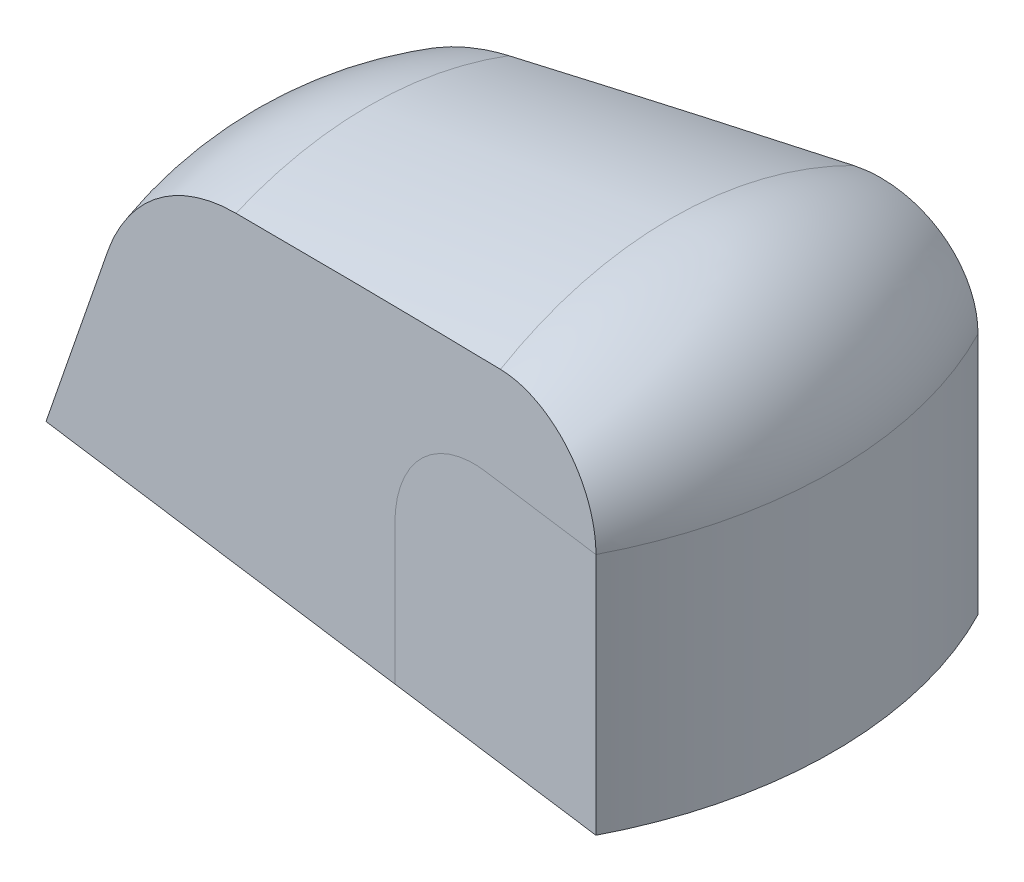
ISO-10303-21;
HEADER;
FILE_DESCRIPTION(('STEP AP214'),'2;1');
FILE_NAME('part.step','',(''),(''),'','','');
FILE_SCHEMA(('AUTOMOTIVE_DESIGN { 1 0 10303 214 1 1 1 1 }'));
ENDSEC;
DATA;
#1=APPLICATION_CONTEXT('core data for automotive mechanical design processes');
#2=APPLICATION_PROTOCOL_DEFINITION('international standard','automotive_design',2000,#1);
#3=PRODUCT_CONTEXT('',#1,'mechanical');
#4=PRODUCT('Part','Part','',(#3));
#5=PRODUCT_RELATED_PRODUCT_CATEGORY('part','',(#4));
#6=PRODUCT_DEFINITION_FORMATION('','',#4);
#7=PRODUCT_DEFINITION_CONTEXT('part definition',#1,'design');
#8=PRODUCT_DEFINITION('design','',#6,#7);
#9=PRODUCT_DEFINITION_SHAPE('','',#8);
#10=(LENGTH_UNIT() NAMED_UNIT(*) SI_UNIT(.MILLI.,.METRE.));
#11=(NAMED_UNIT(*) PLANE_ANGLE_UNIT() SI_UNIT($,.RADIAN.));
#12=(NAMED_UNIT(*) SI_UNIT($,.STERADIAN.) SOLID_ANGLE_UNIT());
#13=UNCERTAINTY_MEASURE_WITH_UNIT(LENGTH_MEASURE(1.E-05),#10,'distance_accuracy_value','');
#14=(GEOMETRIC_REPRESENTATION_CONTEXT(3) GLOBAL_UNCERTAINTY_ASSIGNED_CONTEXT((#13)) GLOBAL_UNIT_ASSIGNED_CONTEXT((#10,
#11,#12)) REPRESENTATION_CONTEXT('',''));
#15=CARTESIAN_POINT('',(0.,0.,0.));
#16=DIRECTION('',(0.,0.,1.));
#17=DIRECTION('',(1.,0.,0.));
#18=AXIS2_PLACEMENT_3D('',#15,#16,#17);
#19=CARTESIAN_POINT('',(60.,20.,-27.51));
#20=DIRECTION('',(-1.,0.,0.));
#21=DIRECTION('',(0.,-1.,0.));
#22=AXIS2_PLACEMENT_3D('',#19,#20,#21);
#23=PLANE('',#22);
#24=DIRECTION('',(0.,0.,1.));
#25=VECTOR('',#24,1.);
#26=CARTESIAN_POINT('',(60.,0.,0.));
#27=LINE('',#26,#25);
#28=CARTESIAN_POINT('',(60.,0.,-23.1124405786884));
#29=VERTEX_POINT('',#28);
#30=CARTESIAN_POINT('',(60.,0.,23.1124405786883));
#31=VERTEX_POINT('',#30);
#32=EDGE_CURVE('E103',#29,#31,#27,.T.);
#33=ORIENTED_EDGE('',*,*,#32,.T.);
#34=DIRECTION('',(0.,1.,0.));
#35=VECTOR('',#34,1.);
#36=CARTESIAN_POINT('',(60.0000000000001,255.23667626419,23.1124405786884));
#37=LINE('',#36,#35);
#38=CARTESIAN_POINT('',(60.,20.,23.1124405786884));
#39=VERTEX_POINT('',#38);
#40=EDGE_CURVE('E128',#31,#39,#37,.T.);
#41=ORIENTED_EDGE('',*,*,#40,.T.);
#42=DIRECTION('',(0.,0.,1.));
#43=VECTOR('',#42,1.);
#44=CARTESIAN_POINT('',(60.,20.,-27.51));
#45=LINE('',#44,#43);
#46=CARTESIAN_POINT('',(60.,20.,-23.1124405786884));
#47=VERTEX_POINT('',#46);
#48=EDGE_CURVE('E12',#47,#39,#45,.T.);
#49=ORIENTED_EDGE('',*,*,#48,.F.);
#50=DIRECTION('',(0.,-1.,0.));
#51=VECTOR('',#50,1.);
#52=CARTESIAN_POINT('',(60.0000000000001,255.23667626419,-23.1124405786884));
#53=LINE('',#52,#51);
#54=EDGE_CURVE('E96',#47,#29,#53,.T.);
#55=ORIENTED_EDGE('',*,*,#54,.T.);
#56=EDGE_LOOP('',(#33,#41,#49,#55));
#57=FACE_BOUND('',#56,.T.);
#58=ADVANCED_FACE('F45',(#57),#23,.T.);
#59=CARTESIAN_POINT('',(100.,35.,-27.51));
#60=DIRECTION('',(0.,1.,0.));
#61=DIRECTION('',(0.,0.,1.));
#62=AXIS2_PLACEMENT_3D('',#59,#60,#61);
#63=PLANE('',#62);
#64=CARTESIAN_POINT('',(39.9999999999999,35.,0.));
#65=DIRECTION('',(0.,-1.,0.));
#66=DIRECTION('',(0.,0.,-1.));
#67=AXIS2_PLACEMENT_3D('',#64,#65,#66);
#68=CIRCLE('',#67,60.);
#69=CARTESIAN_POINT('',(93.3268225192538,35.,-27.5));
#70=VERTEX_POINT('',#69);
#71=CARTESIAN_POINT('',(93.3268225192538,35.,27.5));
#72=VERTEX_POINT('',#71);
#73=EDGE_CURVE('E107',#70,#72,#68,.T.);
#74=ORIENTED_EDGE('',*,*,#73,.F.);
#75=DIRECTION('',(-0.99144486137381,0.,0.130526192220052));
#76=VECTOR('',#75,1.);
#77=CARTESIAN_POINT('',(93.3268225192539,35.,-27.5));
#78=LINE('',#77,#76);
#79=CARTESIAN_POINT('',(75.,35.,-25.0872280424993));
#80=VERTEX_POINT('',#79);
#81=EDGE_CURVE('E112',#70,#80,#78,.T.);
#82=ORIENTED_EDGE('',*,*,#81,.T.);
#83=DIRECTION('',(0.,0.,1.));
#84=VECTOR('',#83,1.);
#85=CARTESIAN_POINT('',(75.,35.,-27.51));
#86=LINE('',#85,#84);
#87=CARTESIAN_POINT('',(75.,35.,25.0872280424993));
#88=VERTEX_POINT('',#87);
#89=EDGE_CURVE('E54',#80,#88,#86,.T.);
#90=ORIENTED_EDGE('',*,*,#89,.T.);
#91=DIRECTION('',(0.99144486137381,0.,0.130526192220052));
#92=VECTOR('',#91,1.);
#93=CARTESIAN_POINT('',(93.3268225192539,35.,27.5));
#94=LINE('',#93,#92);
#95=EDGE_CURVE('E108',#88,#72,#94,.T.);
#96=ORIENTED_EDGE('',*,*,#95,.T.);
#97=EDGE_LOOP('',(#74,#82,#90,#96));
#98=FACE_BOUND('',#97,.T.);
#99=ADVANCED_FACE('F131',(#98),#63,.T.);
#100=CARTESIAN_POINT('',(75.,20.,-27.51));
#101=DIRECTION('',(0.,0.,1.));
#102=DIRECTION('',(1.,0.,0.));
#103=AXIS2_PLACEMENT_3D('',#100,#101,#102);
#104=CYLINDRICAL_SURFACE('',#103,15.);
#105=ORIENTED_EDGE('',*,*,#48,.T.);
#106=CARTESIAN_POINT('',(75.,20.,25.0872280424993));
#107=DIRECTION('',(0.130526192220052,0.,-0.99144486137381));
#108=DIRECTION('',(0.99144486137381,0.,0.130526192220052));
#109=AXIS2_PLACEMENT_3D('',#106,#107,#108);
#110=ELLIPSE('',#109,15.1294344087023,15.);
#111=EDGE_CURVE('E125',#39,#88,#110,.T.);
#112=ORIENTED_EDGE('',*,*,#111,.T.);
#113=ORIENTED_EDGE('',*,*,#89,.F.);
#114=CARTESIAN_POINT('',(75.,20.,-25.0872280424993));
#115=DIRECTION('',(0.130526192220052,0.,0.99144486137381));
#116=DIRECTION('',(-0.99144486137381,0.,0.130526192220052));
#117=AXIS2_PLACEMENT_3D('',#114,#115,#116);
#118=ELLIPSE('',#117,15.1294344087023,15.);
#119=EDGE_CURVE('E110',#80,#47,#118,.T.);
#120=ORIENTED_EDGE('',*,*,#119,.T.);
#121=EDGE_LOOP('',(#105,#112,#113,#120));
#122=FACE_BOUND('',#121,.T.);
#123=ADVANCED_FACE('F141',(#122),#104,.T.);
#124=CARTESIAN_POINT('',(56.3815572471545,0.,0.));
#125=DIRECTION('',(0.,1.,0.));
#126=DIRECTION('',(0.,0.,1.));
#127=AXIS2_PLACEMENT_3D('',#124,#125,#126);
#128=PLANE('',#127);
#129=ORIENTED_EDGE('',*,*,#32,.F.);
#130=DIRECTION('',(-0.99144486137381,0.,0.130526192220052));
#131=VECTOR('',#130,1.);
#132=CARTESIAN_POINT('',(93.3268225192539,0.,-27.5));
#133=LINE('',#132,#131);
#134=CARTESIAN_POINT('',(93.3268225192539,0.,-27.5));
#135=VERTEX_POINT('',#134);
#136=EDGE_CURVE('E49',#135,#29,#133,.T.);
#137=ORIENTED_EDGE('',*,*,#136,.F.);
#138=CARTESIAN_POINT('',(40.,0.,0.));
#139=DIRECTION('',(0.,1.,0.));
#140=DIRECTION('',(0.,0.,1.));
#141=AXIS2_PLACEMENT_3D('',#138,#139,#140);
#142=CIRCLE('',#141,60.);
#143=CARTESIAN_POINT('',(93.3268225192539,0.,27.5));
#144=VERTEX_POINT('',#143);
#145=EDGE_CURVE('E101',#144,#135,#142,.T.);
#146=ORIENTED_EDGE('',*,*,#145,.F.);
#147=DIRECTION('',(0.99144486137381,0.,0.130526192220052));
#148=VECTOR('',#147,1.);
#149=CARTESIAN_POINT('',(93.3268225192539,0.,27.5));
#150=LINE('',#149,#148);
#151=EDGE_CURVE('E70',#31,#144,#150,.T.);
#152=ORIENTED_EDGE('',*,*,#151,.F.);
#153=EDGE_LOOP('',(#129,#137,#146,#152));
#154=FACE_BOUND('',#153,.T.);
#155=ADVANCED_FACE('F104',(#154),#128,.F.);
#156=CARTESIAN_POINT('',(93.3268225192539,255.23667626419,27.5));
#157=DIRECTION('',(0.130526192220052,0.,-0.99144486137381));
#158=DIRECTION('',(-0.99144486137381,0.,-0.130526192220052));
#159=AXIS2_PLACEMENT_3D('',#156,#157,#158);
#160=PLANE('',#159);
#161=ORIENTED_EDGE('',*,*,#95,.F.);
#162=ORIENTED_EDGE('',*,*,#111,.F.);
#163=ORIENTED_EDGE('',*,*,#40,.F.);
#164=ORIENTED_EDGE('',*,*,#151,.T.);
#165=DIRECTION('',(0.,-1.,0.));
#166=VECTOR('',#165,1.);
#167=CARTESIAN_POINT('',(93.3268225192539,255.23667626419,27.5));
#168=LINE('',#167,#166);
#169=EDGE_CURVE('E115',#72,#144,#168,.T.);
#170=ORIENTED_EDGE('',*,*,#169,.F.);
#171=EDGE_LOOP('',(#161,#162,#163,#164,#170));
#172=FACE_BOUND('',#171,.T.);
#173=ADVANCED_FACE('F135',(#172),#160,.F.);
#174=CARTESIAN_POINT('',(93.3268225192539,255.23667626419,-27.5));
#175=DIRECTION('',(0.130526192220052,0.,0.99144486137381));
#176=DIRECTION('',(0.99144486137381,0.,-0.130526192220052));
#177=AXIS2_PLACEMENT_3D('',#174,#175,#176);
#178=PLANE('',#177);
#179=ORIENTED_EDGE('',*,*,#81,.F.);
#180=DIRECTION('',(0.,-1.,0.));
#181=VECTOR('',#180,1.);
#182=CARTESIAN_POINT('',(93.3268225192539,255.23667626419,-27.5));
#183=LINE('',#182,#181);
#184=EDGE_CURVE('E62',#70,#135,#183,.T.);
#185=ORIENTED_EDGE('',*,*,#184,.T.);
#186=ORIENTED_EDGE('',*,*,#136,.T.);
#187=ORIENTED_EDGE('',*,*,#54,.F.);
#188=ORIENTED_EDGE('',*,*,#119,.F.);
#189=EDGE_LOOP('',(#179,#185,#186,#187,#188));
#190=FACE_BOUND('',#189,.T.);
#191=ADVANCED_FACE('F47',(#190),#178,.F.);
#192=CARTESIAN_POINT('',(40.,255.23667626419,0.));
#193=DIRECTION('',(0.,-1.,0.));
#194=DIRECTION('',(0.,0.,-1.));
#195=AXIS2_PLACEMENT_3D('',#192,#193,#194);
#196=CYLINDRICAL_SURFACE('',#195,60.);
#197=ORIENTED_EDGE('',*,*,#184,.F.);
#198=ORIENTED_EDGE('',*,*,#73,.T.);
#199=ORIENTED_EDGE('',*,*,#169,.T.);
#200=ORIENTED_EDGE('',*,*,#145,.T.);
#201=EDGE_LOOP('',(#197,#198,#199,#200));
#202=FACE_BOUND('',#201,.T.);
#203=ADVANCED_FACE('F132',(#202),#196,.T.);
#204=CLOSED_SHELL('',(#58,#99,#123,#155,#173,#191,#203));
#205=MANIFOLD_SOLID_BREP('B2',#204);
#206=CARTESIAN_POINT('',(100.,35.,-27.51));
#207=DIRECTION('',(0.,1.,0.));
#208=DIRECTION('',(0.,0.,1.));
#209=AXIS2_PLACEMENT_3D('',#206,#207,#208);
#210=PLANE('',#209);
#211=CARTESIAN_POINT('',(39.9999999999999,35.,0.));
#212=DIRECTION('',(0.,-1.,0.));
#213=DIRECTION('',(0.,0.,-1.));
#214=AXIS2_PLACEMENT_3D('',#211,#212,#213);
#215=CIRCLE('',#214,60.);
#216=CARTESIAN_POINT('',(93.3268225192538,35.,-27.5));
#217=VERTEX_POINT('',#216);
#218=CARTESIAN_POINT('',(93.3268225192538,35.,27.5));
#219=VERTEX_POINT('',#218);
#220=EDGE_CURVE('E357',#217,#219,#215,.T.);
#221=ORIENTED_EDGE('',*,*,#220,.T.);
#222=DIRECTION('',(0.99144486137381,0.,0.130526192220052));
#223=VECTOR('',#222,1.);
#224=CARTESIAN_POINT('',(93.3268225192539,35.,27.5));
#225=LINE('',#224,#223);
#226=CARTESIAN_POINT('',(75.,35.,25.0872280424993));
#227=VERTEX_POINT('',#226);
#228=EDGE_CURVE('E219',#227,#219,#225,.T.);
#229=ORIENTED_EDGE('',*,*,#228,.F.);
#230=DIRECTION('',(0.,0.,1.));
#231=VECTOR('',#230,1.);
#232=CARTESIAN_POINT('',(75.,35.,-27.51));
#233=LINE('',#232,#231);
#234=CARTESIAN_POINT('',(75.,35.,-25.0872280424993));
#235=VERTEX_POINT('',#234);
#236=EDGE_CURVE('E203',#235,#227,#233,.T.);
#237=ORIENTED_EDGE('',*,*,#236,.F.);
#238=DIRECTION('',(-0.99144486137381,0.,0.130526192220052));
#239=VECTOR('',#238,1.);
#240=CARTESIAN_POINT('',(93.3268225192539,35.,-27.5));
#241=LINE('',#240,#239);
#242=EDGE_CURVE('E211',#217,#235,#241,.T.);
#243=ORIENTED_EDGE('',*,*,#242,.F.);
#244=EDGE_LOOP('',(#221,#229,#237,#243));
#245=FACE_BOUND('',#244,.T.);
#246=ADVANCED_FACE('F195',(#245),#210,.F.);
#247=CARTESIAN_POINT('',(60.,20.,-27.51));
#248=DIRECTION('',(-1.,0.,0.));
#249=DIRECTION('',(0.,-1.,0.));
#250=AXIS2_PLACEMENT_3D('',#247,#248,#249);
#251=PLANE('',#250);
#252=DIRECTION('',(0.,0.,1.));
#253=VECTOR('',#252,1.);
#254=CARTESIAN_POINT('',(60.,0.,0.));
#255=LINE('',#254,#253);
#256=CARTESIAN_POINT('',(60.,0.,-23.1124405786884));
#257=VERTEX_POINT('',#256);
#258=CARTESIAN_POINT('',(60.,0.,23.1124405786883));
#259=VERTEX_POINT('',#258);
#260=EDGE_CURVE('E358',#257,#259,#255,.T.);
#261=ORIENTED_EDGE('',*,*,#260,.F.);
#262=DIRECTION('',(0.,-1.,0.));
#263=VECTOR('',#262,1.);
#264=CARTESIAN_POINT('',(60.0000000000001,255.23667626419,-23.1124405786884));
#265=LINE('',#264,#263);
#266=CARTESIAN_POINT('',(60.,20.,-23.1124405786884));
#267=VERTEX_POINT('',#266);
#268=EDGE_CURVE('E270',#267,#257,#265,.T.);
#269=ORIENTED_EDGE('',*,*,#268,.F.);
#270=DIRECTION('',(0.,0.,1.));
#271=VECTOR('',#270,1.);
#272=CARTESIAN_POINT('',(60.,20.,-27.51));
#273=LINE('',#272,#271);
#274=CARTESIAN_POINT('',(60.,20.,23.1124405786884));
#275=VERTEX_POINT('',#274);
#276=EDGE_CURVE('E43',#267,#275,#273,.T.);
#277=ORIENTED_EDGE('',*,*,#276,.T.);
#278=DIRECTION('',(0.,1.,0.));
#279=VECTOR('',#278,1.);
#280=CARTESIAN_POINT('',(60.0000000000001,255.23667626419,23.1124405786884));
#281=LINE('',#280,#279);
#282=EDGE_CURVE('E347',#259,#275,#281,.T.);
#283=ORIENTED_EDGE('',*,*,#282,.F.);
#284=EDGE_LOOP('',(#261,#269,#277,#283));
#285=FACE_BOUND('',#284,.T.);
#286=ADVANCED_FACE('F371',(#285),#251,.F.);
#287=CARTESIAN_POINT('',(75.,20.,-27.51));
#288=DIRECTION('',(0.,0.,1.));
#289=DIRECTION('',(1.,0.,0.));
#290=AXIS2_PLACEMENT_3D('',#287,#288,#289);
#291=CYLINDRICAL_SURFACE('',#290,15.);
#292=ORIENTED_EDGE('',*,*,#276,.F.);
#293=CARTESIAN_POINT('',(75.,20.,-25.0872280424993));
#294=DIRECTION('',(0.130526192220052,0.,0.99144486137381));
#295=DIRECTION('',(-0.99144486137381,0.,0.130526192220052));
#296=AXIS2_PLACEMENT_3D('',#293,#294,#295);
#297=ELLIPSE('',#296,15.1294344087023,15.);
#298=EDGE_CURVE('E364',#235,#267,#297,.T.);
#299=ORIENTED_EDGE('',*,*,#298,.F.);
#300=ORIENTED_EDGE('',*,*,#236,.T.);
#301=CARTESIAN_POINT('',(75.,20.,25.0872280424993));
#302=DIRECTION('',(0.130526192220052,0.,-0.99144486137381));
#303=DIRECTION('',(0.99144486137381,0.,0.130526192220052));
#304=AXIS2_PLACEMENT_3D('',#301,#302,#303);
#305=ELLIPSE('',#304,15.1294344087023,15.);
#306=EDGE_CURVE('E198',#275,#227,#305,.T.);
#307=ORIENTED_EDGE('',*,*,#306,.F.);
#308=EDGE_LOOP('',(#292,#299,#300,#307));
#309=FACE_BOUND('',#308,.T.);
#310=ADVANCED_FACE('F369',(#309),#291,.F.);
#311=CARTESIAN_POINT('',(56.3815572471545,0.,0.));
#312=DIRECTION('',(0.,1.,0.));
#313=DIRECTION('',(0.,0.,1.));
#314=AXIS2_PLACEMENT_3D('',#311,#312,#313);
#315=PLANE('',#314);
#316=DIRECTION('',(-0.99144486137381,0.,0.130526192220052));
#317=VECTOR('',#316,1.);
#318=CARTESIAN_POINT('',(93.3268225192539,0.,-27.5));
#319=LINE('',#318,#317);
#320=CARTESIAN_POINT('',(2.16695173821391,0.,-15.4985753319318));
#321=VERTEX_POINT('',#320);
#322=EDGE_CURVE('E262',#257,#321,#319,.T.);
#323=ORIENTED_EDGE('',*,*,#322,.F.);
#324=ORIENTED_EDGE('',*,*,#260,.T.);
#325=DIRECTION('',(0.99144486137381,0.,0.130526192220052));
#326=VECTOR('',#325,1.);
#327=CARTESIAN_POINT('',(93.3268225192539,0.,27.5));
#328=LINE('',#327,#326);
#329=CARTESIAN_POINT('',(2.16695173821391,0.,15.4985753319318));
#330=VERTEX_POINT('',#329);
#331=EDGE_CURVE('E274',#330,#259,#328,.T.);
#332=ORIENTED_EDGE('',*,*,#331,.F.);
#333=CARTESIAN_POINT('',(63.8506663485546,0.,0.));
#334=DIRECTION('',(0.,1.,0.));
#335=DIRECTION('',(-1.,0.,0.));
#336=AXIS2_PLACEMENT_3D('',#333,#334,#335);
#337=ELLIPSE('',#336,63.8506663485547,60.);
#338=EDGE_CURVE('E277',#330,#321,#337,.F.);
#339=ORIENTED_EDGE('',*,*,#338,.T.);
#340=EDGE_LOOP('',(#323,#324,#332,#339));
#341=FACE_BOUND('',#340,.T.);
#342=ADVANCED_FACE('F278',(#341),#315,.F.);
#343=CARTESIAN_POINT('',(93.3268225192539,255.23667626419,27.5));
#344=DIRECTION('',(0.130526192220052,0.,-0.99144486137381));
#345=DIRECTION('',(-0.99144486137381,0.,-0.130526192220052));
#346=AXIS2_PLACEMENT_3D('',#343,#344,#345);
#347=PLANE('',#346);
#348=ORIENTED_EDGE('',*,*,#306,.T.);
#349=ORIENTED_EDGE('',*,*,#228,.T.);
#350=CARTESIAN_POINT('',(93.3268225178485,34.9998,27.499999999815));
#351=CARTESIAN_POINT('',(93.3268683034229,35.3877097842383,27.5000060276002));
#352=CARTESIAN_POINT('',(93.3109752496171,35.775612973377,27.4979136673724));
#353=CARTESIAN_POINT('',(93.2476042633621,36.5487565230597,27.4895707187573));
#354=CARTESIAN_POINT('',(93.2001287754357,36.9339970873627,27.4833204521976));
#355=CARTESIAN_POINT('',(93.0739297594179,37.6989591585251,27.4667060365458));
#356=CARTESIAN_POINT('',(92.9952280965879,38.0786843349265,27.45634476607));
#357=CARTESIAN_POINT('',(92.8071470978168,38.8303267327103,27.431583432833));
#358=CARTESIAN_POINT('',(92.6977673705556,39.2022438544304,27.4171833185537));
#359=CARTESIAN_POINT('',(92.4460924887322,39.9446274259901,27.3840496917816));
#360=CARTESIAN_POINT('',(92.3030662327973,40.3148419411402,27.3652199279672));
#361=CARTESIAN_POINT('',(91.9866948738407,41.0418499455034,27.3235688483954));
#362=CARTESIAN_POINT('',(91.8133493599273,41.3986432527506,27.3007474785432));
#363=CARTESIAN_POINT('',(91.4376275482313,42.0962813900502,27.2512827636353));
#364=CARTESIAN_POINT('',(91.2352539300133,42.4371276883132,27.2246397713511));
#365=CARTESIAN_POINT('',(90.8029385167879,43.1005390792901,27.1677243674545));
#366=CARTESIAN_POINT('',(90.572996839144,43.4231042498223,27.1374519712932));
#367=CARTESIAN_POINT('',(90.0860740780005,44.0491882361452,27.0733473736565));
#368=CARTESIAN_POINT('',(89.8289721654542,44.3526114517577,27.0394992647353));
#369=CARTESIAN_POINT('',(89.2904776127902,44.936673638168,26.9686051119399));
#370=CARTESIAN_POINT('',(89.0090848447677,45.2173124889783,26.9315590512267));
#371=CARTESIAN_POINT('',(88.4240027303283,45.7539084333673,26.854531529567));
#372=CARTESIAN_POINT('',(88.1203113898256,46.0098633147957,26.8145498060942));
#373=CARTESIAN_POINT('',(87.4928175958532,46.4953246887369,26.7319386808971));
#374=CARTESIAN_POINT('',(87.1690150966275,46.7248311210717,26.689309273149));
#375=CARTESIAN_POINT('',(86.5011593037406,47.1574210010816,26.6013843899873));
#376=CARTESIAN_POINT('',(86.1569755855261,47.3602996197469,26.5560717438554));
#377=CARTESIAN_POINT('',(85.4529710679222,47.7362755093234,26.4633877908));
#378=CARTESIAN_POINT('',(85.0931500635285,47.9093723896493,26.4160164568872));
#379=CARTESIAN_POINT('',(84.3602806102729,48.2246737698517,26.3195323629606));
#380=CARTESIAN_POINT('',(83.987227204912,48.3668665486678,26.2704189504113));
#381=CARTESIAN_POINT('',(83.2306602580876,48.6193169130488,26.1708150222698));
#382=CARTESIAN_POINT('',(82.8471470309052,48.729575456972,26.1203245480535));
#383=CARTESIAN_POINT('',(82.0693376656864,48.9181523758402,26.0179240024756));
#384=CARTESIAN_POINT('',(81.6749810681299,48.9962171010344,25.9660059714672));
#385=CARTESIAN_POINT('',(80.8811574499937,49.1186407191432,25.8614971094957));
#386=CARTESIAN_POINT('',(80.4816904505636,49.1629997515041,25.808906281317));
#387=CARTESIAN_POINT('',(79.6810858808787,49.2176734963038,25.7035046901381));
#388=CARTESIAN_POINT('',(79.2799516893248,49.2280388682229,25.6506943719523));
#389=CARTESIAN_POINT('',(78.4784002226552,49.2147892985258,25.5451681194204));
#390=CARTESIAN_POINT('',(78.07798267621,49.191192843612,25.4924521493531));
#391=CARTESIAN_POINT('',(77.4861069645638,49.1310995979486,25.4145302336535));
#392=CARTESIAN_POINT('',(77.2932835279425,49.1075136360569,25.389144546629));
#393=CARTESIAN_POINT('',(76.9090234661678,49.0524884686388,25.3385557497732));
#394=CARTESIAN_POINT('',(76.7175852483303,49.0210605780116,25.3133524302612));
#395=CARTESIAN_POINT('',(76.5268364466613,48.9857171599046,25.2882398741097));
#396=B_SPLINE_CURVE_WITH_KNOTS('',3,(#350,#351,#352,#353,#354,#355,#356,#357,#358,#359,#360,
#361,#362,#363,#364,#365,#366,#367,#368,#369,#370,#371,#372,#373,#374,#375,#376,#377,#378,#379,
#380,#381,#382,#383,#384,#385,#386,#387,#388,#389,#390,#391,#392,#393,#394,#395),.UNSPECIFIED.,
.F.,.F.,(4,2,2,2,2,2,2,2,2,2,2,2,2,2,2,2,2,2,2,2,2,2,4),(0.,1.16338803606691,2.32668603481804,
3.48917089998247,4.65167059412798,5.84224408883489,7.03283371964058,8.2233135185716,
9.41378824953931,10.6098019258362,11.8058219001931,13.0019489611421,14.1980787435742,
15.4029286552113,16.6077943671665,17.8131162565765,19.0184019700792,20.233010416336,
21.4476138375209,22.6604063561729,23.8725389557687,24.4601370557966,25.0468921806152),.UNSPECIFIED.);
#397=CARTESIAN_POINT('',(77.5080975488052,49.1322810677213,25.4174253489923));
#398=VERTEX_POINT('',#397);
#399=EDGE_CURVE('E303',#219,#398,#396,.T.);
#400=ORIENTED_EDGE('',*,*,#399,.T.);
#401=CARTESIAN_POINT('',(-115.556415580688,-40.0989367929424,0.));
#402=DIRECTION('',(0.130526192220052,0.,-0.99144486137381));
#403=DIRECTION('',(-0.976127540173564,-0.175100829994262,-0.128509628627691));
#404=AXIS2_PLACEMENT_3D('',#401,#402,#403);
#405=ELLIPSE('',#404,466.769126386767,60.);
#406=CARTESIAN_POINT('',(33.6564929253431,43.778969439679,19.6442520770985));
#407=VERTEX_POINT('',#406);
#408=EDGE_CURVE('E321',#398,#407,#405,.F.);
#409=ORIENTED_EDGE('',*,*,#408,.T.);
#410=CARTESIAN_POINT('',(34.2412344014205,43.8483480537515,19.7212347528671));
#411=CARTESIAN_POINT('',(33.8182061784797,43.802955584788,19.665542030767));
#412=CARTESIAN_POINT('',(33.3962664304077,43.7472916272623,19.6099926091019));
#413=CARTESIAN_POINT('',(32.5555261248713,43.6155774053288,19.4993070480556));
#414=CARTESIAN_POINT('',(32.136725568582,43.5395271332908,19.4441709088291));
#415=CARTESIAN_POINT('',(31.3031923729497,43.367189991723,19.3344341818021));
#416=CARTESIAN_POINT('',(30.888460066609,43.2709014798439,19.2798336378422));
#417=CARTESIAN_POINT('',(30.0641039134416,43.0583289880067,19.1713050913762));
#418=CARTESIAN_POINT('',(29.6544800412526,42.9420451073637,19.1173770855311));
#419=CARTESIAN_POINT('',(28.4365183872038,42.5641270831145,18.9570293918099));
#420=CARTESIAN_POINT('',(27.636963181838,42.2729861532423,18.8517659520645));
#421=CARTESIAN_POINT('',(26.0695115562766,41.6147029607462,18.6454070307119));
#422=CARTESIAN_POINT('',(25.3016095736674,41.2475741203262,18.5443108167991));
#423=CARTESIAN_POINT('',(23.8955740683485,40.4897713915574,18.3592027308273));
#424=CARTESIAN_POINT('',(23.2530257767443,40.1074098003063,18.2746096434171));
#425=CARTESIAN_POINT('',(22.0023120784723,39.289312457625,18.1099500612728));
#426=CARTESIAN_POINT('',(21.3941443351572,38.8535803398709,18.0298832589133));
#427=CARTESIAN_POINT('',(20.2164693884888,37.9316924133452,17.8748394108383));
#428=CARTESIAN_POINT('',(19.6469629141677,37.4455356541571,17.7998624611017));
#429=CARTESIAN_POINT('',(18.8250370725628,36.6812910199999,17.6916538712228));
#430=CARTESIAN_POINT('',(18.5564413457932,36.4206975095923,17.6562925729523));
#431=CARTESIAN_POINT('',(18.0303775763319,35.8881852271219,17.5870349638125));
#432=CARTESIAN_POINT('',(17.7729124608624,35.6162635123503,17.5531390383193));
#433=CARTESIAN_POINT('',(17.0199223249502,34.7863854730809,17.4540060062678));
#434=CARTESIAN_POINT('',(16.5416606227811,34.2123237770501,17.3910416586768));
#435=CARTESIAN_POINT('',(15.6350458342965,33.0254264335743,17.2716835574231));
#436=CARTESIAN_POINT('',(15.2066921176597,32.4125912759758,17.2152897207771));
#437=CARTESIAN_POINT('',(14.6042287281973,31.4680389652315,17.1359739108494));
#438=CARTESIAN_POINT('',(14.4101648250907,31.14912276004,17.1104249133138));
#439=CARTESIAN_POINT('',(14.0356540672528,30.5033690962575,17.0611196366711));
#440=CARTESIAN_POINT('',(13.8552040453948,30.1765335035495,17.0373629406038));
#441=CARTESIAN_POINT('',(13.3348558857205,29.185136732603,16.9688578057677));
#442=CARTESIAN_POINT('',(13.0157055499351,28.5092871095602,16.9268408669557));
#443=CARTESIAN_POINT('',(12.5632295902002,27.4360893574511,16.8672712767583));
#444=CARTESIAN_POINT('',(12.4099539253543,27.047129318433,16.847092152662));
#445=CARTESIAN_POINT('',(12.1221210044925,26.2629527246906,16.8091982297427));
#446=CARTESIAN_POINT('',(11.9875334071671,25.8677474996987,16.7914794364105));
#447=CARTESIAN_POINT('',(11.8622944556848,25.4694775048551,16.7749914156526));
#448=B_SPLINE_CURVE_WITH_KNOTS('',3,(#410,#411,#412,#413,#414,#415,#416,#417,#418,#419,#420,
#421,#422,#423,#424,#425,#426,#427,#428,#429,#430,#431,#432,#433,#434,#435,#436,#437,#438,#439,
#440,#441,#442,#443,#444,#445,#446,#447),.UNSPECIFIED.,.F.,.F.,(4,2,2,2,2,2,2,2,2,2,2,2,2,2,2,2,
2,2,4),(0.,1.28712510146855,2.57425068468523,3.86148075952751,5.14870444100437,7.71660762189087,
10.2840576050212,12.5388361378866,14.7934612417742,17.0481288491296,18.1755468421164,
19.3032595514129,21.5498972097151,23.796506490659,24.9187882301712,26.0408080723195,
28.2834308803884,29.5387024701329,30.7919115987865),.UNSPECIFIED.);
#449=CARTESIAN_POINT('',(12.3675711261268,26.9270436256626,16.8415123512889));
#450=VERTEX_POINT('',#449);
#451=EDGE_CURVE('E330',#407,#450,#448,.T.);
#452=ORIENTED_EDGE('',*,*,#451,.T.);
#453=CARTESIAN_POINT('',(-115.556415580688,-492.916906490844,0.));
#454=DIRECTION('',(0.130526192220052,0.,-0.99144486137381));
#455=DIRECTION('',(-0.336528627829337,-0.940630407919782,-0.0443048343633914));
#456=AXIS2_PLACEMENT_3D('',#453,#454,#455);
#457=ELLIPSE('',#456,1344.00813373944,60.);
#458=EDGE_CURVE('E293',#450,#330,#457,.F.);
#459=ORIENTED_EDGE('',*,*,#458,.T.);
#460=ORIENTED_EDGE('',*,*,#331,.T.);
#461=ORIENTED_EDGE('',*,*,#282,.T.);
#462=EDGE_LOOP('',(#348,#349,#400,#409,#452,#459,#460,#461));
#463=FACE_BOUND('',#462,.T.);
#464=ADVANCED_FACE('F324',(#463),#347,.F.);
#465=CARTESIAN_POINT('',(93.3268225192539,255.23667626419,-27.5));
#466=DIRECTION('',(0.130526192220052,0.,0.99144486137381));
#467=DIRECTION('',(0.99144486137381,0.,-0.130526192220052));
#468=AXIS2_PLACEMENT_3D('',#465,#466,#467);
#469=PLANE('',#468);
#470=CARTESIAN_POINT('',(76.5268364466613,48.9857171599045,-25.2882398741097));
#471=CARTESIAN_POINT('',(76.7374296190035,49.0247376069483,-25.3159649912234));
#472=CARTESIAN_POINT('',(76.9488619980617,49.0589848366463,-25.3438005919973));
#473=CARTESIAN_POINT('',(77.3730359770706,49.1178815049061,-25.3996441557454));
#474=CARTESIAN_POINT('',(77.5857775725988,49.1425309758707,-25.4276521181374));
#475=CARTESIAN_POINT('',(78.2253066242007,49.2019960291574,-25.5118477150605));
#476=CARTESIAN_POINT('',(78.6535053103058,49.2223480527342,-25.5682211415499));
#477=CARTESIAN_POINT('',(79.5093668044657,49.2242798970624,-25.6808974448449));
#478=CARTESIAN_POINT('',(79.9370295864216,49.2059100258243,-25.7372003182146));
#479=CARTESIAN_POINT('',(80.7890031666439,49.1306546423974,-25.8493647679293));
#480=CARTESIAN_POINT('',(81.2133142183743,49.0737720713725,-25.9052263776436));
#481=CARTESIAN_POINT('',(82.0305764038177,48.9263717283684,-26.0128209855409));
#482=CARTESIAN_POINT('',(82.4239119932648,48.8380118665506,-26.0646045982816));
#483=CARTESIAN_POINT('',(83.2017901970738,48.6281439142921,-26.1670142066319));
#484=CARTESIAN_POINT('',(83.5863330473104,48.5066367141974,-26.2176402332949));
#485=CARTESIAN_POINT('',(84.3437894397228,48.2313347792638,-26.3173612591695));
#486=CARTESIAN_POINT('',(84.7167054923124,48.0775470705408,-26.3664565888834));
#487=CARTESIAN_POINT('',(85.4483164211015,47.7387234959853,-26.4627749949207));
#488=CARTESIAN_POINT('',(85.8070112502997,47.5536875268878,-26.5099980650563));
#489=CARTESIAN_POINT('',(86.506850668422,47.1540628118316,-26.6021336723623));
#490=CARTESIAN_POINT('',(86.8480302447542,46.9395364018409,-26.6470508157122));
#491=CARTESIAN_POINT('',(87.5111626878737,46.4821238889,-26.7343538580801));
#492=CARTESIAN_POINT('',(87.8331155830329,46.2392378278007,-26.7767397608333));
#493=CARTESIAN_POINT('',(88.4554282521745,45.7268096233895,-26.8586687780061));
#494=CARTESIAN_POINT('',(88.7557888540962,45.4572685030874,-26.8982120014259));
#495=CARTESIAN_POINT('',(89.3327163409354,44.8934167140683,-26.9741659459951));
#496=CARTESIAN_POINT('',(89.6092832981275,44.5991061205955,-27.0105766766596));
#497=CARTESIAN_POINT('',(90.1348545745816,43.989787987026,-27.079769447865));
#498=CARTESIAN_POINT('',(90.3840262855521,43.6749273293611,-27.1125735259424));
#499=CARTESIAN_POINT('',(90.855010689384,43.0250405463497,-27.1745797990316));
#500=CARTESIAN_POINT('',(91.0768238166372,42.6900147413052,-27.2037820512321));
#501=CARTESIAN_POINT('',(91.4914837900117,42.0021022821102,-27.2583730723764));
#502=CARTESIAN_POINT('',(91.6843249548994,41.6492121429586,-27.2837610933715));
#503=CARTESIAN_POINT('',(92.0395433394681,40.9281607130537,-27.3305264808889));
#504=CARTESIAN_POINT('',(92.2019195417641,40.5599989128006,-27.35190371347));
#505=CARTESIAN_POINT('',(92.5093117068897,39.7744013704814,-27.3923726597476));
#506=CARTESIAN_POINT('',(92.6510787284819,39.3556671237224,-27.4110366422157));
#507=CARTESIAN_POINT('',(92.8951150066718,38.5066283245569,-27.4431646277413));
#508=CARTESIAN_POINT('',(92.9973797208723,38.0763224476025,-27.4566280327809));
#509=CARTESIAN_POINT('',(93.1616373619387,37.2069077405835,-27.4782529614751));
#510=CARTESIAN_POINT('',(93.2235417610318,36.7677817226775,-27.4864028302273));
#511=CARTESIAN_POINT('',(93.2854895709444,36.1062916910471,-27.4945584141224));
#512=CARTESIAN_POINT('',(93.3009873808708,35.885298076722,-27.4965987395064));
#513=CARTESIAN_POINT('',(93.3216554519593,35.4428142005873,-27.4993197426855));
#514=CARTESIAN_POINT('',(93.3268254394277,35.2213239257717,-27.5000003844482));
#515=CARTESIAN_POINT('',(93.3268225178485,34.9998,-27.499999999815));
#516=B_SPLINE_CURVE_WITH_KNOTS('',3,(#470,#471,#472,#473,#474,#475,#476,#477,#478,#479,#480,
#481,#482,#483,#484,#485,#486,#487,#488,#489,#490,#491,#492,#493,#494,#495,#496,#497,#498,#499,
#500,#501,#502,#503,#504,#505,#506,#507,#508,#509,#510,#511,#512,#513,#514,#515),.UNSPECIFIED.,
.F.,.F.,(4,2,2,2,2,2,2,2,2,2,2,2,2,2,2,2,2,2,2,2,2,2,4),(0.,0.647780127291769,1.29555806760701,
2.59078607386517,3.88433233959999,5.17777983005365,6.3957024144877,7.61359228843106,
8.83121735308772,10.0488464416679,11.2639402254489,12.4790322161219,13.6940775901767,
14.9091192733249,16.116267265585,17.3233960886309,18.5307613145348,19.7381668535262,
21.0636076696802,22.3892008538344,23.7176919462857,24.3821173878367,25.0465604368429),.UNSPECIFIED.);
#517=CARTESIAN_POINT('',(77.5080975488052,49.1322810677213,-25.4174253489923));
#518=VERTEX_POINT('',#517);
#519=EDGE_CURVE('E295',#518,#217,#516,.T.);
#520=ORIENTED_EDGE('',*,*,#519,.T.);
#521=ORIENTED_EDGE('',*,*,#242,.T.);
#522=ORIENTED_EDGE('',*,*,#298,.T.);
#523=ORIENTED_EDGE('',*,*,#268,.T.);
#524=ORIENTED_EDGE('',*,*,#322,.T.);
#525=CARTESIAN_POINT('',(-115.556415580688,-492.916906490843,0.));
#526=DIRECTION('',(0.130526192220052,0.,0.99144486137381));
#527=DIRECTION('',(-0.336528627829337,-0.940630407919782,0.0443048343633914));
#528=AXIS2_PLACEMENT_3D('',#525,#526,#527);
#529=ELLIPSE('',#528,1344.00813373944,60.);
#530=CARTESIAN_POINT('',(12.3675711261268,26.9270436256626,-16.841512351289));
#531=VERTEX_POINT('',#530);
#532=EDGE_CURVE('E268',#321,#531,#529,.F.);
#533=ORIENTED_EDGE('',*,*,#532,.T.);
#534=CARTESIAN_POINT('',(11.8622944556848,25.4694775048551,-16.7749914156526));
#535=CARTESIAN_POINT('',(11.9739124025379,25.8244362749185,-16.7896861971314));
#536=CARTESIAN_POINT('',(12.0929623599063,26.1769736390732,-16.8053594213566));
#537=CARTESIAN_POINT('',(12.3457215339805,26.8766508352059,-16.8386357979116));
#538=CARTESIAN_POINT('',(12.4794303769263,27.2237908045447,-16.856238901035));
#539=CARTESIAN_POINT('',(12.902168807723,28.256118082126,-16.9118934712755));
#540=CARTESIAN_POINT('',(13.2128726211234,28.9324108419933,-16.9527984043196));
#541=CARTESIAN_POINT('',(13.889397832759,30.2554797792659,-17.0418646381123));
#542=CARTESIAN_POINT('',(14.2551636244457,30.9022848870242,-17.0900186181199));
#543=CARTESIAN_POINT('',(14.8431868276885,31.8473140265131,-17.1674333414661));
#544=CARTESIAN_POINT('',(15.0457667462879,32.158140421517,-17.1941034937108));
#545=CARTESIAN_POINT('',(15.4637637908361,32.7709961119107,-17.2491338486097));
#546=CARTESIAN_POINT('',(15.6791841124672,33.0730231892725,-17.2774944719835));
#547=CARTESIAN_POINT('',(16.3441205634182,33.9650487579862,-17.3650350164881));
#548=CARTESIAN_POINT('',(16.8123388259642,34.5410343970978,-17.4266771201683));
#549=CARTESIAN_POINT('',(17.7950329752902,35.6512437845676,-17.5560512592916));
#550=CARTESIAN_POINT('',(18.3095100169795,36.1854664896383,-17.6237834467814));
#551=CARTESIAN_POINT('',(19.3811561926304,37.2085804318558,-17.7648683423358));
#552=CARTESIAN_POINT('',(19.9383303949479,37.6974662720305,-17.8382217176622));
#553=CARTESIAN_POINT('',(21.0913169790649,38.6264149556686,-17.990015281146));
#554=CARTESIAN_POINT('',(21.6871283898029,39.0664790254074,-18.0684553414607));
#555=CARTESIAN_POINT('',(22.9159078150594,39.8966279070011,-18.2302272217797));
#556=CARTESIAN_POINT('',(23.5490308532402,40.2864790974615,-18.3135794510363));
#557=CARTESIAN_POINT('',(24.845569566221,41.0112121635873,-18.484272010819));
#558=CARTESIAN_POINT('',(25.5089846865302,41.3460950449219,-18.5716122683449));
#559=CARTESIAN_POINT('',(26.522855177968,41.8052843827125,-18.7050908507729));
#560=CARTESIAN_POINT('',(26.863867296826,41.9511337300868,-18.7499859479281));
#561=CARTESIAN_POINT('',(27.5515662113507,42.2282534918194,-18.8405232276134));
#562=CARTESIAN_POINT('',(27.8982515899333,42.3595274849535,-18.8861652235809));
#563=CARTESIAN_POINT('',(28.9458326293764,42.731111707463,-19.0240818838487));
#564=CARTESIAN_POINT('',(29.6545823375722,42.9493331820476,-19.1173905530971));
#565=CARTESIAN_POINT('',(31.0068476621079,43.3040036164375,-19.295419660473));
#566=CARTESIAN_POINT('',(31.6487221124305,43.4468935418002,-19.3799240349955));
#567=CARTESIAN_POINT('',(32.9399381094512,43.6840509164133,-19.5499158459281));
#568=CARTESIAN_POINT('',(33.5892625290803,43.7784132406668,-19.6354010275168));
#569=CARTESIAN_POINT('',(34.2412344014205,43.8483480537515,-19.7212347528671));
#570=B_SPLINE_CURVE_WITH_KNOTS('',3,(#534,#535,#536,#537,#538,#539,#540,#541,#542,#543,#544,
#545,#546,#547,#548,#549,#550,#551,#552,#553,#554,#555,#556,#557,#558,#559,#560,#561,#562,#563,
#564,#565,#566,#567,#568,#569),.UNSPECIFIED.,.F.,.F.,(4,2,2,2,2,2,2,2,2,2,2,2,2,2,2,2,2,4),(0.,
1.11698694211301,2.23394541084306,4.46724093002377,6.69829601146979,7.81392158089054,
8.9298259727707,11.1614835957494,13.3931969503793,15.6251756315772,17.8570982385971,
20.0990563637059,22.3409734666355,23.4614885620693,24.5817279193033,26.8211183991943,
28.8083426602532,30.7916668398522),.UNSPECIFIED.);
#571=CARTESIAN_POINT('',(33.6564929253431,43.778969439679,-19.6442520770985));
#572=VERTEX_POINT('',#571);
#573=EDGE_CURVE('E287',#531,#572,#570,.T.);
#574=ORIENTED_EDGE('',*,*,#573,.T.);
#575=CARTESIAN_POINT('',(-115.556415580688,-40.0989367929424,0.));
#576=DIRECTION('',(0.130526192220052,0.,0.99144486137381));
#577=DIRECTION('',(-0.976127540173564,-0.175100829994262,0.128509628627691));
#578=AXIS2_PLACEMENT_3D('',#575,#576,#577);
#579=ELLIPSE('',#578,466.769126386767,60.);
#580=EDGE_CURVE('E289',#572,#518,#579,.F.);
#581=ORIENTED_EDGE('',*,*,#580,.T.);
#582=EDGE_LOOP('',(#520,#521,#522,#523,#524,#533,#574,#581));
#583=FACE_BOUND('',#582,.T.);
#584=ADVANCED_FACE('F265',(#583),#469,.F.);
#585=CARTESIAN_POINT('',(38.2916946226489,17.4914343234876,0.));
#586=DIRECTION('',(0.,0.,1.));
#587=DIRECTION('',(1.,0.,0.));
#588=AXIS2_PLACEMENT_3D('',#585,#586,#587);
#589=DEGENERATE_TOROIDAL_SURFACE('',#588,30.,60.,.F.);
#590=CARTESIAN_POINT('',(66.4824732462261,7.23083002371747,0.));
#591=DIRECTION('',(0.342020143325668,0.939692620785909,0.));
#592=DIRECTION('',(0.,0.,-1.));
#593=AXIS2_PLACEMENT_3D('',#590,#591,#592);
#594=CIRCLE('',#593,60.);
#595=EDGE_CURVE('E286',#531,#450,#594,.T.);
#596=ORIENTED_EDGE('',*,*,#595,.T.);
#597=ORIENTED_EDGE('',*,*,#451,.F.);
#598=CARTESIAN_POINT('',(43.5011399526567,-12.0527982668787,0.));
#599=DIRECTION('',(0.984807753012208,0.173648177666929,0.));
#600=DIRECTION('',(0.,0.,-1.));
#601=AXIS2_PLACEMENT_3D('',#598,#599,#600);
#602=CIRCLE('',#601,60.);
#603=EDGE_CURVE('E350',#572,#407,#602,.T.);
#604=ORIENTED_EDGE('',*,*,#603,.F.);
#605=ORIENTED_EDGE('',*,*,#573,.F.);
#606=EDGE_LOOP('',(#596,#597,#604,#605));
#607=FACE_BOUND('',#606,.T.);
#608=ADVANCED_FACE('F338',(#607),#589,.F.);
#609=CARTESIAN_POINT('',(86.945927106677,-4.39231012048834,0.));
#610=DIRECTION('',(-0.984807753012208,-0.173648177666931,0.));
#611=DIRECTION('',(0.173648177666931,-0.984807753012208,0.));
#612=AXIS2_PLACEMENT_3D('',#609,#610,#611);
#613=CYLINDRICAL_SURFACE('',#612,60.);
#614=ORIENTED_EDGE('',*,*,#603,.T.);
#615=ORIENTED_EDGE('',*,*,#408,.F.);
#616=CARTESIAN_POINT('',(86.945927106677,-4.39231012048834,0.));
#617=DIRECTION('',(0.984807753012208,0.173648177666929,0.));
#618=DIRECTION('',(0.,0.,-1.));
#619=AXIS2_PLACEMENT_3D('',#616,#617,#618);
#620=CIRCLE('',#619,60.);
#621=EDGE_CURVE('E352',#518,#398,#620,.T.);
#622=ORIENTED_EDGE('',*,*,#621,.F.);
#623=ORIENTED_EDGE('',*,*,#580,.F.);
#624=EDGE_LOOP('',(#614,#615,#622,#623));
#625=FACE_BOUND('',#624,.T.);
#626=ADVANCED_FACE('F311',(#625),#613,.T.);
#627=CARTESIAN_POINT('',(79.9999999999999,35.,0.));
#628=DIRECTION('',(0.,0.,1.));
#629=DIRECTION('',(1.,0.,0.));
#630=AXIS2_PLACEMENT_3D('',#627,#628,#629);
#631=DEGENERATE_TOROIDAL_SURFACE('',#630,40.,60.,.F.);
#632=ORIENTED_EDGE('',*,*,#621,.T.);
#633=ORIENTED_EDGE('',*,*,#399,.F.);
#634=ORIENTED_EDGE('',*,*,#220,.F.);
#635=ORIENTED_EDGE('',*,*,#519,.F.);
#636=EDGE_LOOP('',(#632,#633,#634,#635));
#637=FACE_BOUND('',#636,.T.);
#638=ADVANCED_FACE('F307',(#637),#631,.F.);
#639=CARTESIAN_POINT('',(66.4824732462261,7.23083002371746,0.));
#640=DIRECTION('',(-0.342020143325666,-0.939692620785909,0.));
#641=DIRECTION('',(0.93969262078591,-0.342020143325666,0.));
#642=AXIS2_PLACEMENT_3D('',#639,#640,#641);
#643=CYLINDRICAL_SURFACE('',#642,60.);
#644=ORIENTED_EDGE('',*,*,#532,.F.);
#645=ORIENTED_EDGE('',*,*,#338,.F.);
#646=ORIENTED_EDGE('',*,*,#458,.F.);
#647=ORIENTED_EDGE('',*,*,#595,.F.);
#648=EDGE_LOOP('',(#644,#645,#646,#647));
#649=FACE_BOUND('',#648,.T.);
#650=ADVANCED_FACE('F284',(#649),#643,.T.);
#651=CLOSED_SHELL('',(#246,#286,#310,#342,#464,#584,#608,#626,#638,#650));
#652=MANIFOLD_SOLID_BREP('B6',#651);
#653=ADVANCED_BREP_SHAPE_REPRESENTATION('',(#18,#205,#652),#14);
#654=SHAPE_DEFINITION_REPRESENTATION(#9,#653);
ENDSEC;
END-ISO-10303-21;
